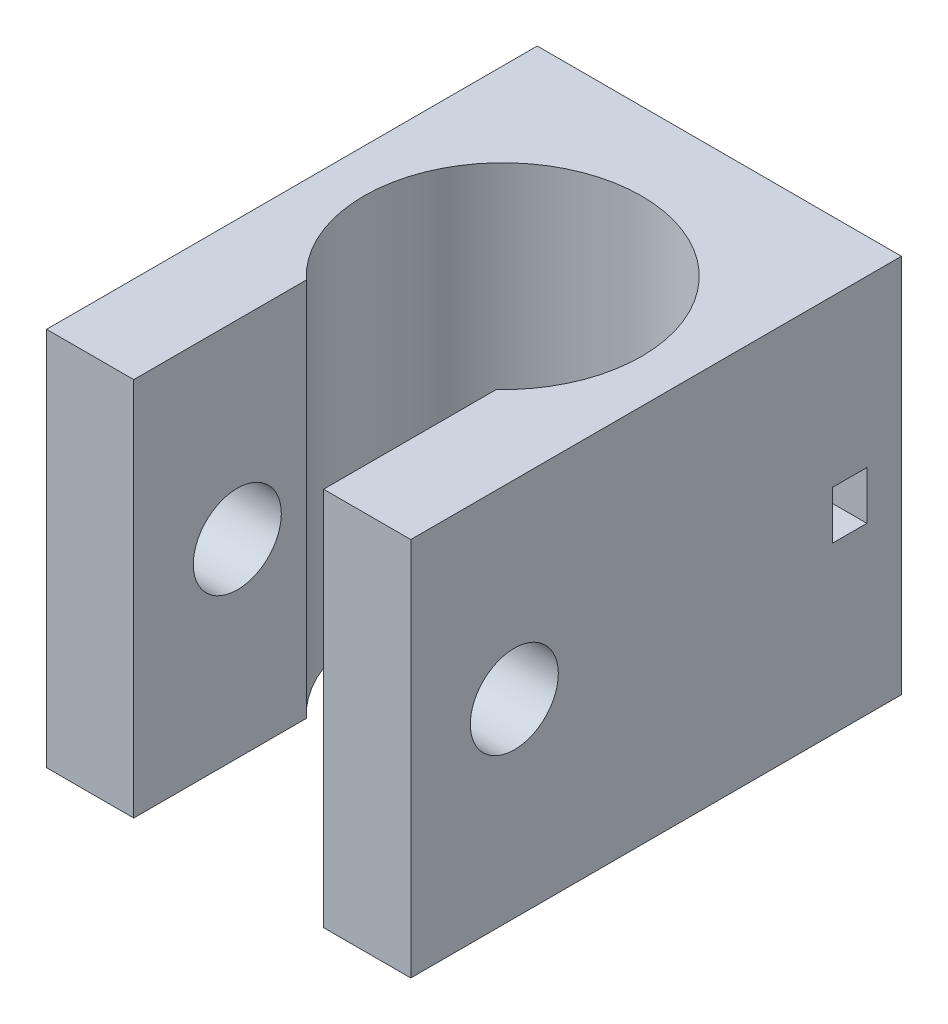
ISO-10303-21;
HEADER;
FILE_DESCRIPTION(('STEP AP214'),'2;1');
FILE_NAME('part.step','',(''),(''),'','','');
FILE_SCHEMA(('AUTOMOTIVE_DESIGN { 1 0 10303 214 1 1 1 1 }'));
ENDSEC;
DATA;
#1=APPLICATION_CONTEXT('core data for automotive mechanical design processes');
#2=APPLICATION_PROTOCOL_DEFINITION('international standard','automotive_design',2000,#1);
#3=PRODUCT_CONTEXT('',#1,'mechanical');
#4=PRODUCT('Part','Part','',(#3));
#5=PRODUCT_RELATED_PRODUCT_CATEGORY('part','',(#4));
#6=PRODUCT_DEFINITION_FORMATION('','',#4);
#7=PRODUCT_DEFINITION_CONTEXT('part definition',#1,'design');
#8=PRODUCT_DEFINITION('design','',#6,#7);
#9=PRODUCT_DEFINITION_SHAPE('','',#8);
#10=(LENGTH_UNIT() NAMED_UNIT(*) SI_UNIT(.MILLI.,.METRE.));
#11=(NAMED_UNIT(*) PLANE_ANGLE_UNIT() SI_UNIT($,.RADIAN.));
#12=(NAMED_UNIT(*) SI_UNIT($,.STERADIAN.) SOLID_ANGLE_UNIT());
#13=UNCERTAINTY_MEASURE_WITH_UNIT(LENGTH_MEASURE(1.E-05),#10,'distance_accuracy_value','');
#14=(GEOMETRIC_REPRESENTATION_CONTEXT(3) GLOBAL_UNCERTAINTY_ASSIGNED_CONTEXT((#13)) GLOBAL_UNIT_ASSIGNED_CONTEXT((#10,
#11,#12)) REPRESENTATION_CONTEXT('',''));
#15=CARTESIAN_POINT('',(0.,0.,0.));
#16=DIRECTION('',(0.,0.,1.));
#17=DIRECTION('',(1.,0.,0.));
#18=AXIS2_PLACEMENT_3D('',#15,#16,#17);
#19=CARTESIAN_POINT('',(-10.55,11.,-13.4281374601144));
#20=DIRECTION('',(0.,0.,1.));
#21=DIRECTION('',(1.,0.,0.));
#22=AXIS2_PLACEMENT_3D('',#19,#20,#21);
#23=PLANE('',#22);
#24=DIRECTION('',(0.,-1.,0.));
#25=VECTOR('',#24,1.);
#26=CARTESIAN_POINT('',(2.40000000000001,8.55,-13.4281374601144));
#27=LINE('',#26,#25);
#28=CARTESIAN_POINT('',(2.40000000000001,8.55,-13.4281374601144));
#29=VERTEX_POINT('',#28);
#30=CARTESIAN_POINT('',(2.40000000000001,3.65,-13.4281374601144));
#31=VERTEX_POINT('',#30);
#32=EDGE_CURVE('E193',#29,#31,#27,.T.);
#33=ORIENTED_EDGE('',*,*,#32,.F.);
#34=DIRECTION('',(1.,0.,0.));
#35=VECTOR('',#34,1.);
#36=CARTESIAN_POINT('',(2.40000000000001,8.55,-13.4281374601144));
#37=LINE('',#36,#35);
#38=CARTESIAN_POINT('',(-2.49999999999999,8.55,-13.4281374601144));
#39=VERTEX_POINT('',#38);
#40=EDGE_CURVE('E206',#39,#29,#37,.T.);
#41=ORIENTED_EDGE('',*,*,#40,.F.);
#42=DIRECTION('',(0.,1.,0.));
#43=VECTOR('',#42,1.);
#44=CARTESIAN_POINT('',(-2.49999999999999,8.55,-13.4281374601144));
#45=LINE('',#44,#43);
#46=CARTESIAN_POINT('',(-2.49999999999999,3.65,-13.4281374601144));
#47=VERTEX_POINT('',#46);
#48=EDGE_CURVE('E215',#47,#39,#45,.T.);
#49=ORIENTED_EDGE('',*,*,#48,.F.);
#50=DIRECTION('',(-1.,0.,0.));
#51=VECTOR('',#50,1.);
#52=CARTESIAN_POINT('',(2.40000000000001,3.65,-13.4281374601144));
#53=LINE('',#52,#51);
#54=EDGE_CURVE('E196',#31,#47,#53,.T.);
#55=ORIENTED_EDGE('',*,*,#54,.F.);
#56=EDGE_LOOP('',(#33,#41,#49,#55));
#57=FACE_BOUND('',#56,.T.);
#58=DIRECTION('',(-1.,0.,0.));
#59=VECTOR('',#58,1.);
#60=CARTESIAN_POINT('',(-10.55,-11.,-13.4281374601144));
#61=LINE('',#60,#59);
#62=CARTESIAN_POINT('',(10.55,-11.,-13.4281374601144));
#63=VERTEX_POINT('',#62);
#64=CARTESIAN_POINT('',(-10.55,-11.,-13.4281374601144));
#65=VERTEX_POINT('',#64);
#66=EDGE_CURVE('E302',#63,#65,#61,.T.);
#67=ORIENTED_EDGE('',*,*,#66,.T.);
#68=DIRECTION('',(0.,-1.,0.));
#69=VECTOR('',#68,1.);
#70=CARTESIAN_POINT('',(-10.55,11.,-13.4281374601144));
#71=LINE('',#70,#69);
#72=CARTESIAN_POINT('',(-10.55,11.,-13.4281374601144));
#73=VERTEX_POINT('',#72);
#74=EDGE_CURVE('E312',#73,#65,#71,.T.);
#75=ORIENTED_EDGE('',*,*,#74,.F.);
#76=DIRECTION('',(-1.,0.,0.));
#77=VECTOR('',#76,1.);
#78=CARTESIAN_POINT('',(-10.55,11.,-13.4281374601144));
#79=LINE('',#78,#77);
#80=CARTESIAN_POINT('',(10.55,11.,-13.4281374601144));
#81=VERTEX_POINT('',#80);
#82=EDGE_CURVE('E285',#81,#73,#79,.T.);
#83=ORIENTED_EDGE('',*,*,#82,.F.);
#84=DIRECTION('',(0.,-1.,0.));
#85=VECTOR('',#84,1.);
#86=CARTESIAN_POINT('',(10.55,11.,-13.4281374601144));
#87=LINE('',#86,#85);
#88=EDGE_CURVE('E315',#81,#63,#87,.T.);
#89=ORIENTED_EDGE('',*,*,#88,.T.);
#90=EDGE_LOOP('',(#67,#75,#83,#89));
#91=FACE_BOUND('',#90,.T.);
#92=DIRECTION('',(0.,1.,0.));
#93=VECTOR('',#92,1.);
#94=CARTESIAN_POINT('',(-2.49999999999999,-3.65,-13.4281374601144));
#95=LINE('',#94,#93);
#96=CARTESIAN_POINT('',(-2.49999999999999,-8.55,-13.4281374601144));
#97=VERTEX_POINT('',#96);
#98=CARTESIAN_POINT('',(-2.49999999999999,-3.65,-13.4281374601144));
#99=VERTEX_POINT('',#98);
#100=EDGE_CURVE('E192',#97,#99,#95,.T.);
#101=ORIENTED_EDGE('',*,*,#100,.F.);
#102=DIRECTION('',(-1.,0.,0.));
#103=VECTOR('',#102,1.);
#104=CARTESIAN_POINT('',(-2.49999999999999,-8.55,-13.4281374601144));
#105=LINE('',#104,#103);
#106=CARTESIAN_POINT('',(2.40000000000001,-8.55,-13.4281374601144));
#107=VERTEX_POINT('',#106);
#108=EDGE_CURVE('E189',#107,#97,#105,.T.);
#109=ORIENTED_EDGE('',*,*,#108,.F.);
#110=DIRECTION('',(0.,-1.,0.));
#111=VECTOR('',#110,1.);
#112=CARTESIAN_POINT('',(2.40000000000001,-3.65,-13.4281374601144));
#113=LINE('',#112,#111);
#114=CARTESIAN_POINT('',(2.40000000000001,-3.65,-13.4281374601144));
#115=VERTEX_POINT('',#114);
#116=EDGE_CURVE('E55',#115,#107,#113,.T.);
#117=ORIENTED_EDGE('',*,*,#116,.F.);
#118=DIRECTION('',(1.,0.,0.));
#119=VECTOR('',#118,1.);
#120=CARTESIAN_POINT('',(-2.49999999999999,-3.65,-13.4281374601144));
#121=LINE('',#120,#119);
#122=EDGE_CURVE('E50',#99,#115,#121,.T.);
#123=ORIENTED_EDGE('',*,*,#122,.F.);
#124=EDGE_LOOP('',(#101,#109,#117,#123));
#125=FACE_BOUND('',#124,.T.);
#126=ADVANCED_FACE('F35',(#57,#91,#125),#23,.F.);
#127=CARTESIAN_POINT('',(-5.49999999999999,11.,15.));
#128=DIRECTION('',(-1.,0.,0.));
#129=DIRECTION('',(0.,0.,1.));
#130=AXIS2_PLACEMENT_3D('',#127,#128,#129);
#131=PLANE('',#130);
#132=CARTESIAN_POINT('',(-5.49999999999999,0.,9.));
#133=DIRECTION('',(-1.,0.,0.));
#134=DIRECTION('',(0.,0.,1.));
#135=AXIS2_PLACEMENT_3D('',#132,#133,#134);
#136=CIRCLE('',#135,2.55);
#137=CARTESIAN_POINT('',(-5.49999999999999,0.,11.55));
#138=VERTEX_POINT('',#137);
#139=EDGE_CURVE('E269',#138,#138,#136,.T.);
#140=ORIENTED_EDGE('',*,*,#139,.T.);
#141=EDGE_LOOP('',(#140));
#142=FACE_BOUND('',#141,.T.);
#143=DIRECTION('',(0.,0.,-1.));
#144=VECTOR('',#143,1.);
#145=CARTESIAN_POINT('',(-5.49999999999999,-11.,15.));
#146=LINE('',#145,#144);
#147=CARTESIAN_POINT('',(-5.49999999999999,-11.,15.));
#148=VERTEX_POINT('',#147);
#149=CARTESIAN_POINT('',(-5.49999999999999,-11.,5.));
#150=VERTEX_POINT('',#149);
#151=EDGE_CURVE('E272',#148,#150,#146,.T.);
#152=ORIENTED_EDGE('',*,*,#151,.T.);
#153=DIRECTION('',(0.,-1.,0.));
#154=VECTOR('',#153,1.);
#155=CARTESIAN_POINT('',(-5.49999999999999,11.,5.));
#156=LINE('',#155,#154);
#157=CARTESIAN_POINT('',(-5.49999999999999,11.,5.));
#158=VERTEX_POINT('',#157);
#159=EDGE_CURVE('E11',#158,#150,#156,.T.);
#160=ORIENTED_EDGE('',*,*,#159,.F.);
#161=DIRECTION('',(0.,0.,-1.));
#162=VECTOR('',#161,1.);
#163=CARTESIAN_POINT('',(-5.49999999999999,11.,15.));
#164=LINE('',#163,#162);
#165=CARTESIAN_POINT('',(-5.49999999999999,11.,15.));
#166=VERTEX_POINT('',#165);
#167=EDGE_CURVE('E273',#166,#158,#164,.T.);
#168=ORIENTED_EDGE('',*,*,#167,.F.);
#169=DIRECTION('',(0.,-1.,0.));
#170=VECTOR('',#169,1.);
#171=CARTESIAN_POINT('',(-5.49999999999999,11.,15.));
#172=LINE('',#171,#170);
#173=EDGE_CURVE('E291',#166,#148,#172,.T.);
#174=ORIENTED_EDGE('',*,*,#173,.T.);
#175=EDGE_LOOP('',(#152,#160,#168,#174));
#176=FACE_BOUND('',#175,.T.);
#177=ADVANCED_FACE('F37',(#142,#176),#131,.F.);
#178=CARTESIAN_POINT('',(0.,11.,-0.878137460114387));
#179=DIRECTION('',(0.,-1.,0.));
#180=DIRECTION('',(0.,0.,-1.));
#181=AXIS2_PLACEMENT_3D('',#178,#179,#180);
#182=CYLINDRICAL_SURFACE('',#181,8.05);
#183=CARTESIAN_POINT('',(0.,-11.,-0.878137460114387));
#184=DIRECTION('',(0.,-1.,0.));
#185=DIRECTION('',(0.,0.,-1.));
#186=AXIS2_PLACEMENT_3D('',#183,#184,#185);
#187=CIRCLE('',#186,8.05);
#188=CARTESIAN_POINT('',(5.50000000000001,-11.,5.));
#189=VERTEX_POINT('',#188);
#190=EDGE_CURVE('E294',#150,#189,#187,.T.);
#191=ORIENTED_EDGE('',*,*,#190,.T.);
#192=DIRECTION('',(0.,-1.,0.));
#193=VECTOR('',#192,1.);
#194=CARTESIAN_POINT('',(5.50000000000001,11.,5.));
#195=LINE('',#194,#193);
#196=CARTESIAN_POINT('',(5.50000000000001,11.,5.));
#197=VERTEX_POINT('',#196);
#198=EDGE_CURVE('E43',#197,#189,#195,.T.);
#199=ORIENTED_EDGE('',*,*,#198,.F.);
#200=CARTESIAN_POINT('',(0.,11.,-0.878137460114387));
#201=DIRECTION('',(0.,-1.,0.));
#202=DIRECTION('',(0.,0.,-1.));
#203=AXIS2_PLACEMENT_3D('',#200,#201,#202);
#204=CIRCLE('',#203,8.05);
#205=EDGE_CURVE('E276',#158,#197,#204,.T.);
#206=ORIENTED_EDGE('',*,*,#205,.F.);
#207=ORIENTED_EDGE('',*,*,#159,.T.);
#208=EDGE_LOOP('',(#191,#199,#206,#207));
#209=FACE_BOUND('',#208,.T.);
#210=ADVANCED_FACE('F351',(#209),#182,.F.);
#211=CARTESIAN_POINT('',(5.50000000000001,11.,15.));
#212=DIRECTION('',(1.,0.,0.));
#213=DIRECTION('',(0.,0.,-1.));
#214=AXIS2_PLACEMENT_3D('',#211,#212,#213);
#215=PLANE('',#214);
#216=CARTESIAN_POINT('',(5.50000000000001,0.,8.99999999999999));
#217=DIRECTION('',(1.,0.,0.));
#218=DIRECTION('',(0.,0.,-1.));
#219=AXIS2_PLACEMENT_3D('',#216,#217,#218);
#220=CIRCLE('',#219,2.55);
#221=CARTESIAN_POINT('',(5.50000000000001,0.,6.44999999999999));
#222=VERTEX_POINT('',#221);
#223=EDGE_CURVE('E266',#222,#222,#220,.T.);
#224=ORIENTED_EDGE('',*,*,#223,.T.);
#225=EDGE_LOOP('',(#224));
#226=FACE_BOUND('',#225,.T.);
#227=DIRECTION('',(0.,0.,1.));
#228=VECTOR('',#227,1.);
#229=CARTESIAN_POINT('',(5.50000000000001,-11.,15.));
#230=LINE('',#229,#228);
#231=CARTESIAN_POINT('',(5.50000000000001,-11.,15.));
#232=VERTEX_POINT('',#231);
#233=EDGE_CURVE('E296',#189,#232,#230,.T.);
#234=ORIENTED_EDGE('',*,*,#233,.T.);
#235=DIRECTION('',(0.,-1.,0.));
#236=VECTOR('',#235,1.);
#237=CARTESIAN_POINT('',(5.50000000000001,11.,15.));
#238=LINE('',#237,#236);
#239=CARTESIAN_POINT('',(5.50000000000001,11.,15.));
#240=VERTEX_POINT('',#239);
#241=EDGE_CURVE('E321',#240,#232,#238,.T.);
#242=ORIENTED_EDGE('',*,*,#241,.F.);
#243=DIRECTION('',(0.,0.,1.));
#244=VECTOR('',#243,1.);
#245=CARTESIAN_POINT('',(5.50000000000001,11.,15.));
#246=LINE('',#245,#244);
#247=EDGE_CURVE('E279',#197,#240,#246,.T.);
#248=ORIENTED_EDGE('',*,*,#247,.F.);
#249=ORIENTED_EDGE('',*,*,#198,.T.);
#250=EDGE_LOOP('',(#234,#242,#248,#249));
#251=FACE_BOUND('',#250,.T.);
#252=ADVANCED_FACE('F328',(#226,#251),#215,.F.);
#253=CARTESIAN_POINT('',(10.55,11.,15.));
#254=DIRECTION('',(0.,0.,-1.));
#255=DIRECTION('',(-1.,0.,0.));
#256=AXIS2_PLACEMENT_3D('',#253,#254,#255);
#257=PLANE('',#256);
#258=DIRECTION('',(1.,0.,0.));
#259=VECTOR('',#258,1.);
#260=CARTESIAN_POINT('',(10.55,-11.,15.));
#261=LINE('',#260,#259);
#262=CARTESIAN_POINT('',(10.55,-11.,15.));
#263=VERTEX_POINT('',#262);
#264=EDGE_CURVE('E298',#232,#263,#261,.T.);
#265=ORIENTED_EDGE('',*,*,#264,.T.);
#266=DIRECTION('',(0.,-1.,0.));
#267=VECTOR('',#266,1.);
#268=CARTESIAN_POINT('',(10.55,11.,15.));
#269=LINE('',#268,#267);
#270=CARTESIAN_POINT('',(10.55,11.,15.));
#271=VERTEX_POINT('',#270);
#272=EDGE_CURVE('E318',#271,#263,#269,.T.);
#273=ORIENTED_EDGE('',*,*,#272,.F.);
#274=DIRECTION('',(1.,0.,0.));
#275=VECTOR('',#274,1.);
#276=CARTESIAN_POINT('',(10.55,11.,15.));
#277=LINE('',#276,#275);
#278=EDGE_CURVE('E281',#240,#271,#277,.T.);
#279=ORIENTED_EDGE('',*,*,#278,.F.);
#280=ORIENTED_EDGE('',*,*,#241,.T.);
#281=EDGE_LOOP('',(#265,#273,#279,#280));
#282=FACE_BOUND('',#281,.T.);
#283=ADVANCED_FACE('F339',(#282),#257,.F.);
#284=CARTESIAN_POINT('',(10.55,11.,-13.4281374601144));
#285=DIRECTION('',(-1.,0.,0.));
#286=DIRECTION('',(0.,0.,1.));
#287=AXIS2_PLACEMENT_3D('',#284,#285,#286);
#288=PLANE('',#287);
#289=DIRECTION('',(0.,0.,-1.));
#290=VECTOR('',#289,1.);
#291=CARTESIAN_POINT('',(10.55,-1.4,-9.42813746011439));
#292=LINE('',#291,#290);
#293=CARTESIAN_POINT('',(10.55,-1.4,-9.42813746011438));
#294=VERTEX_POINT('',#293);
#295=CARTESIAN_POINT('',(10.55,-1.4,-11.4281374601144));
#296=VERTEX_POINT('',#295);
#297=EDGE_CURVE('E242',#294,#296,#292,.T.);
#298=ORIENTED_EDGE('',*,*,#297,.F.);
#299=DIRECTION('',(0.,-1.,0.));
#300=VECTOR('',#299,1.);
#301=CARTESIAN_POINT('',(10.55,1.4,-9.42813746011439));
#302=LINE('',#301,#300);
#303=CARTESIAN_POINT('',(10.55,1.4,-9.42813746011439));
#304=VERTEX_POINT('',#303);
#305=EDGE_CURVE('E231',#304,#294,#302,.T.);
#306=ORIENTED_EDGE('',*,*,#305,.F.);
#307=DIRECTION('',(0.,0.,1.));
#308=VECTOR('',#307,1.);
#309=CARTESIAN_POINT('',(10.55,1.4,-9.42813746011439));
#310=LINE('',#309,#308);
#311=CARTESIAN_POINT('',(10.55,1.4,-11.4281374601144));
#312=VERTEX_POINT('',#311);
#313=EDGE_CURVE('E248',#312,#304,#310,.T.);
#314=ORIENTED_EDGE('',*,*,#313,.F.);
#315=DIRECTION('',(0.,1.,0.));
#316=VECTOR('',#315,1.);
#317=CARTESIAN_POINT('',(10.55,1.4,-11.4281374601144));
#318=LINE('',#317,#316);
#319=EDGE_CURVE('E245',#296,#312,#318,.T.);
#320=ORIENTED_EDGE('',*,*,#319,.F.);
#321=EDGE_LOOP('',(#298,#306,#314,#320));
#322=FACE_BOUND('',#321,.T.);
#323=CARTESIAN_POINT('',(10.55,0.,8.99999999999999));
#324=DIRECTION('',(1.,0.,0.));
#325=DIRECTION('',(0.,0.,-1.));
#326=AXIS2_PLACEMENT_3D('',#323,#324,#325);
#327=CIRCLE('',#326,2.55);
#328=CARTESIAN_POINT('',(10.55,0.,6.44999999999999));
#329=VERTEX_POINT('',#328);
#330=EDGE_CURVE('E260',#329,#329,#327,.T.);
#331=ORIENTED_EDGE('',*,*,#330,.F.);
#332=EDGE_LOOP('',(#331));
#333=FACE_BOUND('',#332,.T.);
#334=DIRECTION('',(0.,0.,-1.));
#335=VECTOR('',#334,1.);
#336=CARTESIAN_POINT('',(10.55,-11.,-13.4281374601144));
#337=LINE('',#336,#335);
#338=EDGE_CURVE('E300',#263,#63,#337,.T.);
#339=ORIENTED_EDGE('',*,*,#338,.T.);
#340=ORIENTED_EDGE('',*,*,#88,.F.);
#341=DIRECTION('',(0.,0.,-1.));
#342=VECTOR('',#341,1.);
#343=CARTESIAN_POINT('',(10.55,11.,-13.4281374601144));
#344=LINE('',#343,#342);
#345=EDGE_CURVE('E283',#271,#81,#344,.T.);
#346=ORIENTED_EDGE('',*,*,#345,.F.);
#347=ORIENTED_EDGE('',*,*,#272,.T.);
#348=EDGE_LOOP('',(#339,#340,#346,#347));
#349=FACE_BOUND('',#348,.T.);
#350=ADVANCED_FACE('F343',(#322,#333,#349),#288,.F.);
#351=CARTESIAN_POINT('',(-10.55,11.,15.));
#352=DIRECTION('',(1.,0.,0.));
#353=DIRECTION('',(0.,0.,-1.));
#354=AXIS2_PLACEMENT_3D('',#351,#352,#353);
#355=PLANE('',#354);
#356=DIRECTION('',(0.,0.,-1.));
#357=VECTOR('',#356,1.);
#358=CARTESIAN_POINT('',(-10.55,1.4,-9.42813746011438));
#359=LINE('',#358,#357);
#360=CARTESIAN_POINT('',(-10.55,1.4,-9.42813746011438));
#361=VERTEX_POINT('',#360);
#362=CARTESIAN_POINT('',(-10.55,1.4,-11.4281374601144));
#363=VERTEX_POINT('',#362);
#364=EDGE_CURVE('E235',#361,#363,#359,.T.);
#365=ORIENTED_EDGE('',*,*,#364,.F.);
#366=DIRECTION('',(0.,1.,0.));
#367=VECTOR('',#366,1.);
#368=CARTESIAN_POINT('',(-10.55,1.4,-9.42813746011438));
#369=LINE('',#368,#367);
#370=CARTESIAN_POINT('',(-10.55,-1.4,-9.42813746011438));
#371=VERTEX_POINT('',#370);
#372=EDGE_CURVE('E238',#371,#361,#369,.T.);
#373=ORIENTED_EDGE('',*,*,#372,.F.);
#374=DIRECTION('',(0.,0.,1.));
#375=VECTOR('',#374,1.);
#376=CARTESIAN_POINT('',(-10.55,-1.4,-9.42813746011438));
#377=LINE('',#376,#375);
#378=CARTESIAN_POINT('',(-10.55,-1.4,-11.4281374601144));
#379=VERTEX_POINT('',#378);
#380=EDGE_CURVE('E240',#379,#371,#377,.T.);
#381=ORIENTED_EDGE('',*,*,#380,.F.);
#382=DIRECTION('',(0.,-1.,0.));
#383=VECTOR('',#382,1.);
#384=CARTESIAN_POINT('',(-10.55,1.4,-11.4281374601144));
#385=LINE('',#384,#383);
#386=EDGE_CURVE('E232',#363,#379,#385,.T.);
#387=ORIENTED_EDGE('',*,*,#386,.F.);
#388=EDGE_LOOP('',(#365,#373,#381,#387));
#389=FACE_BOUND('',#388,.T.);
#390=CARTESIAN_POINT('',(-10.55,0.,9.));
#391=DIRECTION('',(1.,0.,0.));
#392=DIRECTION('',(0.,0.,-1.));
#393=AXIS2_PLACEMENT_3D('',#390,#391,#392);
#394=CIRCLE('',#393,2.55);
#395=CARTESIAN_POINT('',(-10.55,0.,6.44999999999999));
#396=VERTEX_POINT('',#395);
#397=EDGE_CURVE('E263',#396,#396,#394,.F.);
#398=ORIENTED_EDGE('',*,*,#397,.F.);
#399=EDGE_LOOP('',(#398));
#400=FACE_BOUND('',#399,.T.);
#401=DIRECTION('',(0.,0.,1.));
#402=VECTOR('',#401,1.);
#403=CARTESIAN_POINT('',(-10.55,-11.,15.));
#404=LINE('',#403,#402);
#405=CARTESIAN_POINT('',(-10.55,-11.,15.));
#406=VERTEX_POINT('',#405);
#407=EDGE_CURVE('E304',#65,#406,#404,.T.);
#408=ORIENTED_EDGE('',*,*,#407,.T.);
#409=DIRECTION('',(0.,-1.,0.));
#410=VECTOR('',#409,1.);
#411=CARTESIAN_POINT('',(-10.55,11.,15.));
#412=LINE('',#411,#410);
#413=CARTESIAN_POINT('',(-10.55,11.,15.));
#414=VERTEX_POINT('',#413);
#415=EDGE_CURVE('E309',#414,#406,#412,.T.);
#416=ORIENTED_EDGE('',*,*,#415,.F.);
#417=DIRECTION('',(0.,0.,1.));
#418=VECTOR('',#417,1.);
#419=CARTESIAN_POINT('',(-10.55,11.,15.));
#420=LINE('',#419,#418);
#421=EDGE_CURVE('E287',#73,#414,#420,.T.);
#422=ORIENTED_EDGE('',*,*,#421,.F.);
#423=ORIENTED_EDGE('',*,*,#74,.T.);
#424=EDGE_LOOP('',(#408,#416,#422,#423));
#425=FACE_BOUND('',#424,.T.);
#426=ADVANCED_FACE('F362',(#389,#400,#425),#355,.F.);
#427=CARTESIAN_POINT('',(-5.49999999999999,11.,15.));
#428=DIRECTION('',(0.,0.,-1.));
#429=DIRECTION('',(-1.,0.,0.));
#430=AXIS2_PLACEMENT_3D('',#427,#428,#429);
#431=PLANE('',#430);
#432=DIRECTION('',(1.,0.,0.));
#433=VECTOR('',#432,1.);
#434=CARTESIAN_POINT('',(-5.49999999999999,-11.,15.));
#435=LINE('',#434,#433);
#436=EDGE_CURVE('E277',#406,#148,#435,.T.);
#437=ORIENTED_EDGE('',*,*,#436,.T.);
#438=ORIENTED_EDGE('',*,*,#173,.F.);
#439=DIRECTION('',(1.,0.,0.));
#440=VECTOR('',#439,1.);
#441=CARTESIAN_POINT('',(-5.49999999999999,11.,15.));
#442=LINE('',#441,#440);
#443=EDGE_CURVE('E289',#414,#166,#442,.T.);
#444=ORIENTED_EDGE('',*,*,#443,.F.);
#445=ORIENTED_EDGE('',*,*,#415,.T.);
#446=EDGE_LOOP('',(#437,#438,#444,#445));
#447=FACE_BOUND('',#446,.T.);
#448=ADVANCED_FACE('F357',(#447),#431,.F.);
#449=CARTESIAN_POINT('',(0.,11.,-0.878137460114387));
#450=DIRECTION('',(0.,-1.,0.));
#451=DIRECTION('',(0.,0.,-1.));
#452=AXIS2_PLACEMENT_3D('',#449,#450,#451);
#453=PLANE('',#452);
#454=ORIENTED_EDGE('',*,*,#167,.T.);
#455=ORIENTED_EDGE('',*,*,#205,.T.);
#456=ORIENTED_EDGE('',*,*,#247,.T.);
#457=ORIENTED_EDGE('',*,*,#278,.T.);
#458=ORIENTED_EDGE('',*,*,#345,.T.);
#459=ORIENTED_EDGE('',*,*,#82,.T.);
#460=ORIENTED_EDGE('',*,*,#421,.T.);
#461=ORIENTED_EDGE('',*,*,#443,.T.);
#462=EDGE_LOOP('',(#454,#455,#456,#457,#458,#459,#460,#461));
#463=FACE_BOUND('',#462,.T.);
#464=ADVANCED_FACE('F347',(#463),#453,.F.);
#465=CARTESIAN_POINT('',(0.,-11.,-0.878137460114387));
#466=DIRECTION('',(0.,-1.,0.));
#467=DIRECTION('',(0.,0.,-1.));
#468=AXIS2_PLACEMENT_3D('',#465,#466,#467);
#469=PLANE('',#468);
#470=ORIENTED_EDGE('',*,*,#151,.F.);
#471=ORIENTED_EDGE('',*,*,#436,.F.);
#472=ORIENTED_EDGE('',*,*,#407,.F.);
#473=ORIENTED_EDGE('',*,*,#66,.F.);
#474=ORIENTED_EDGE('',*,*,#338,.F.);
#475=ORIENTED_EDGE('',*,*,#264,.F.);
#476=ORIENTED_EDGE('',*,*,#233,.F.);
#477=ORIENTED_EDGE('',*,*,#190,.F.);
#478=EDGE_LOOP('',(#470,#471,#472,#473,#474,#475,#476,#477));
#479=FACE_BOUND('',#478,.T.);
#480=ADVANCED_FACE('F334',(#479),#469,.T.);
#481=CARTESIAN_POINT('',(-17.7624891681028,0.,9.));
#482=DIRECTION('',(1.,0.,0.));
#483=DIRECTION('',(0.,0.,-1.));
#484=AXIS2_PLACEMENT_3D('',#481,#482,#483);
#485=CYLINDRICAL_SURFACE('',#484,2.55);
#486=ORIENTED_EDGE('',*,*,#397,.T.);
#487=EDGE_LOOP('',(#486));
#488=FACE_BOUND('',#487,.T.);
#489=ORIENTED_EDGE('',*,*,#139,.F.);
#490=EDGE_LOOP('',(#489));
#491=FACE_BOUND('',#490,.T.);
#492=ADVANCED_FACE('F431',(#488,#491),#485,.F.);
#493=ORIENTED_EDGE('',*,*,#330,.T.);
#494=EDGE_LOOP('',(#493));
#495=FACE_BOUND('',#494,.T.);
#496=ORIENTED_EDGE('',*,*,#223,.F.);
#497=EDGE_LOOP('',(#496));
#498=FACE_BOUND('',#497,.T.);
#499=ADVANCED_FACE('F429',(#495,#498),#485,.F.);
#500=CARTESIAN_POINT('',(-13.990930106817,1.4,-9.42813746011438));
#501=DIRECTION('',(0.,0.,1.));
#502=DIRECTION('',(1.,0.,0.));
#503=AXIS2_PLACEMENT_3D('',#500,#501,#502);
#504=PLANE('',#503);
#505=ORIENTED_EDGE('',*,*,#372,.T.);
#506=DIRECTION('',(1.,0.,0.));
#507=VECTOR('',#506,1.);
#508=CARTESIAN_POINT('',(-13.990930106817,1.4,-9.42813746011438));
#509=LINE('',#508,#507);
#510=EDGE_CURVE('E236',#361,#304,#509,.T.);
#511=ORIENTED_EDGE('',*,*,#510,.T.);
#512=ORIENTED_EDGE('',*,*,#305,.T.);
#513=DIRECTION('',(1.,0.,0.));
#514=VECTOR('',#513,1.);
#515=CARTESIAN_POINT('',(-13.990930106817,-1.4,-9.42813746011438));
#516=LINE('',#515,#514);
#517=EDGE_CURVE('E251',#371,#294,#516,.T.);
#518=ORIENTED_EDGE('',*,*,#517,.F.);
#519=EDGE_LOOP('',(#505,#511,#512,#518));
#520=FACE_BOUND('',#519,.T.);
#521=ADVANCED_FACE('F419',(#520),#504,.F.);
#522=CARTESIAN_POINT('',(-13.990930106817,1.4,-9.42813746011438));
#523=DIRECTION('',(0.,1.,0.));
#524=DIRECTION('',(0.,0.,1.));
#525=AXIS2_PLACEMENT_3D('',#522,#523,#524);
#526=PLANE('',#525);
#527=ORIENTED_EDGE('',*,*,#364,.T.);
#528=DIRECTION('',(1.,0.,0.));
#529=VECTOR('',#528,1.);
#530=CARTESIAN_POINT('',(-13.990930106817,1.4,-11.4281374601144));
#531=LINE('',#530,#529);
#532=EDGE_CURVE('E253',#363,#312,#531,.T.);
#533=ORIENTED_EDGE('',*,*,#532,.T.);
#534=ORIENTED_EDGE('',*,*,#313,.T.);
#535=ORIENTED_EDGE('',*,*,#510,.F.);
#536=EDGE_LOOP('',(#527,#533,#534,#535));
#537=FACE_BOUND('',#536,.T.);
#538=ADVANCED_FACE('F415',(#537),#526,.F.);
#539=CARTESIAN_POINT('',(-13.990930106817,1.4,-11.4281374601144));
#540=DIRECTION('',(0.,0.,-1.));
#541=DIRECTION('',(0.,1.,0.));
#542=AXIS2_PLACEMENT_3D('',#539,#540,#541);
#543=PLANE('',#542);
#544=ORIENTED_EDGE('',*,*,#386,.T.);
#545=DIRECTION('',(1.,0.,0.));
#546=VECTOR('',#545,1.);
#547=CARTESIAN_POINT('',(-13.990930106817,-1.4,-11.4281374601144));
#548=LINE('',#547,#546);
#549=EDGE_CURVE('E255',#379,#296,#548,.T.);
#550=ORIENTED_EDGE('',*,*,#549,.T.);
#551=ORIENTED_EDGE('',*,*,#319,.T.);
#552=ORIENTED_EDGE('',*,*,#532,.F.);
#553=EDGE_LOOP('',(#544,#550,#551,#552));
#554=FACE_BOUND('',#553,.T.);
#555=ADVANCED_FACE('F418',(#554),#543,.F.);
#556=CARTESIAN_POINT('',(-13.990930106817,-1.4,-9.42813746011438));
#557=DIRECTION('',(0.,-1.,0.));
#558=DIRECTION('',(0.,0.,-1.));
#559=AXIS2_PLACEMENT_3D('',#556,#557,#558);
#560=PLANE('',#559);
#561=ORIENTED_EDGE('',*,*,#380,.T.);
#562=ORIENTED_EDGE('',*,*,#517,.T.);
#563=ORIENTED_EDGE('',*,*,#297,.T.);
#564=ORIENTED_EDGE('',*,*,#549,.F.);
#565=EDGE_LOOP('',(#561,#562,#563,#564));
#566=FACE_BOUND('',#565,.T.);
#567=ADVANCED_FACE('F413',(#566),#560,.F.);
#568=CARTESIAN_POINT('',(2.40000000000001,8.55,-15.4281374601144));
#569=DIRECTION('',(-1.,0.,0.));
#570=DIRECTION('',(0.,-1.,0.));
#571=AXIS2_PLACEMENT_3D('',#568,#569,#570);
#572=PLANE('',#571);
#573=ORIENTED_EDGE('',*,*,#32,.T.);
#574=DIRECTION('',(0.,0.,1.));
#575=VECTOR('',#574,1.);
#576=CARTESIAN_POINT('',(2.40000000000001,3.65,-15.4281374601144));
#577=LINE('',#576,#575);
#578=CARTESIAN_POINT('',(2.40000000000001,3.65,-15.4281374601144));
#579=VERTEX_POINT('',#578);
#580=EDGE_CURVE('E228',#579,#31,#577,.T.);
#581=ORIENTED_EDGE('',*,*,#580,.F.);
#582=DIRECTION('',(0.,-1.,0.));
#583=VECTOR('',#582,1.);
#584=CARTESIAN_POINT('',(2.40000000000001,8.55,-15.4281374601144));
#585=LINE('',#584,#583);
#586=CARTESIAN_POINT('',(2.40000000000001,8.55,-15.4281374601144));
#587=VERTEX_POINT('',#586);
#588=EDGE_CURVE('E202',#587,#579,#585,.T.);
#589=ORIENTED_EDGE('',*,*,#588,.F.);
#590=DIRECTION('',(0.,0.,1.));
#591=VECTOR('',#590,1.);
#592=CARTESIAN_POINT('',(2.40000000000001,8.55,-15.4281374601144));
#593=LINE('',#592,#591);
#594=EDGE_CURVE('E211',#587,#29,#593,.T.);
#595=ORIENTED_EDGE('',*,*,#594,.T.);
#596=EDGE_LOOP('',(#573,#581,#589,#595));
#597=FACE_BOUND('',#596,.T.);
#598=ADVANCED_FACE('F409',(#597),#572,.F.);
#599=CARTESIAN_POINT('',(2.40000000000001,3.65,-15.4281374601144));
#600=DIRECTION('',(0.,1.,0.));
#601=DIRECTION('',(0.,0.,1.));
#602=AXIS2_PLACEMENT_3D('',#599,#600,#601);
#603=PLANE('',#602);
#604=ORIENTED_EDGE('',*,*,#54,.T.);
#605=DIRECTION('',(0.,0.,1.));
#606=VECTOR('',#605,1.);
#607=CARTESIAN_POINT('',(-2.49999999999999,3.65,-15.4281374601144));
#608=LINE('',#607,#606);
#609=CARTESIAN_POINT('',(-2.49999999999999,3.65,-15.4281374601144));
#610=VERTEX_POINT('',#609);
#611=EDGE_CURVE('E225',#610,#47,#608,.T.);
#612=ORIENTED_EDGE('',*,*,#611,.F.);
#613=DIRECTION('',(-1.,0.,0.));
#614=VECTOR('',#613,1.);
#615=CARTESIAN_POINT('',(2.40000000000001,3.65,-15.4281374601144));
#616=LINE('',#615,#614);
#617=EDGE_CURVE('E205',#579,#610,#616,.T.);
#618=ORIENTED_EDGE('',*,*,#617,.F.);
#619=ORIENTED_EDGE('',*,*,#580,.T.);
#620=EDGE_LOOP('',(#604,#612,#618,#619));
#621=FACE_BOUND('',#620,.T.);
#622=ADVANCED_FACE('F405',(#621),#603,.F.);
#623=CARTESIAN_POINT('',(-2.49999999999999,8.55,-15.4281374601144));
#624=DIRECTION('',(1.,0.,0.));
#625=DIRECTION('',(0.,1.,0.));
#626=AXIS2_PLACEMENT_3D('',#623,#624,#625);
#627=PLANE('',#626);
#628=ORIENTED_EDGE('',*,*,#48,.T.);
#629=DIRECTION('',(0.,0.,1.));
#630=VECTOR('',#629,1.);
#631=CARTESIAN_POINT('',(-2.49999999999999,8.55,-15.4281374601144));
#632=LINE('',#631,#630);
#633=CARTESIAN_POINT('',(-2.49999999999999,8.55,-15.4281374601144));
#634=VERTEX_POINT('',#633);
#635=EDGE_CURVE('E222',#634,#39,#632,.T.);
#636=ORIENTED_EDGE('',*,*,#635,.F.);
#637=DIRECTION('',(0.,1.,0.));
#638=VECTOR('',#637,1.);
#639=CARTESIAN_POINT('',(-2.49999999999999,8.55,-15.4281374601144));
#640=LINE('',#639,#638);
#641=EDGE_CURVE('E208',#610,#634,#640,.T.);
#642=ORIENTED_EDGE('',*,*,#641,.F.);
#643=ORIENTED_EDGE('',*,*,#611,.T.);
#644=EDGE_LOOP('',(#628,#636,#642,#643));
#645=FACE_BOUND('',#644,.T.);
#646=ADVANCED_FACE('F401',(#645),#627,.F.);
#647=CARTESIAN_POINT('',(2.40000000000001,8.55,-15.4281374601144));
#648=DIRECTION('',(0.,-1.,0.));
#649=DIRECTION('',(0.,0.,-1.));
#650=AXIS2_PLACEMENT_3D('',#647,#648,#649);
#651=PLANE('',#650);
#652=ORIENTED_EDGE('',*,*,#40,.T.);
#653=ORIENTED_EDGE('',*,*,#594,.F.);
#654=DIRECTION('',(1.,0.,0.));
#655=VECTOR('',#654,1.);
#656=CARTESIAN_POINT('',(2.40000000000001,8.55,-15.4281374601144));
#657=LINE('',#656,#655);
#658=EDGE_CURVE('E210',#634,#587,#657,.T.);
#659=ORIENTED_EDGE('',*,*,#658,.F.);
#660=ORIENTED_EDGE('',*,*,#635,.T.);
#661=EDGE_LOOP('',(#652,#653,#659,#660));
#662=FACE_BOUND('',#661,.T.);
#663=ADVANCED_FACE('F397',(#662),#651,.F.);
#664=CARTESIAN_POINT('',(0.,0.,-15.4281374601144));
#665=DIRECTION('',(0.,0.,-1.));
#666=DIRECTION('',(-1.,0.,0.));
#667=AXIS2_PLACEMENT_3D('',#664,#665,#666);
#668=PLANE('',#667);
#669=ORIENTED_EDGE('',*,*,#588,.T.);
#670=ORIENTED_EDGE('',*,*,#617,.T.);
#671=ORIENTED_EDGE('',*,*,#641,.T.);
#672=ORIENTED_EDGE('',*,*,#658,.T.);
#673=EDGE_LOOP('',(#669,#670,#671,#672));
#674=FACE_BOUND('',#673,.T.);
#675=ADVANCED_FACE('F394',(#674),#668,.T.);
#676=CARTESIAN_POINT('',(-2.49999999999999,-3.65,-15.4281374601144));
#677=DIRECTION('',(1.,0.,0.));
#678=DIRECTION('',(0.,1.,0.));
#679=AXIS2_PLACEMENT_3D('',#676,#677,#678);
#680=PLANE('',#679);
#681=ORIENTED_EDGE('',*,*,#100,.T.);
#682=DIRECTION('',(0.,0.,1.));
#683=VECTOR('',#682,1.);
#684=CARTESIAN_POINT('',(-2.49999999999999,-3.65,-15.4281374601144));
#685=LINE('',#684,#683);
#686=CARTESIAN_POINT('',(-2.49999999999999,-3.65,-15.4281374601144));
#687=VERTEX_POINT('',#686);
#688=EDGE_CURVE('E173',#687,#99,#685,.T.);
#689=ORIENTED_EDGE('',*,*,#688,.F.);
#690=DIRECTION('',(0.,1.,0.));
#691=VECTOR('',#690,1.);
#692=CARTESIAN_POINT('',(-2.49999999999999,-3.65,-15.4281374601144));
#693=LINE('',#692,#691);
#694=CARTESIAN_POINT('',(-2.49999999999999,-8.55,-15.4281374601144));
#695=VERTEX_POINT('',#694);
#696=EDGE_CURVE('E180',#695,#687,#693,.T.);
#697=ORIENTED_EDGE('',*,*,#696,.F.);
#698=DIRECTION('',(0.,0.,1.));
#699=VECTOR('',#698,1.);
#700=CARTESIAN_POINT('',(-2.49999999999999,-8.55,-15.4281374601144));
#701=LINE('',#700,#699);
#702=EDGE_CURVE('E372',#695,#97,#701,.T.);
#703=ORIENTED_EDGE('',*,*,#702,.T.);
#704=EDGE_LOOP('',(#681,#689,#697,#703));
#705=FACE_BOUND('',#704,.T.);
#706=ADVANCED_FACE('F191',(#705),#680,.F.);
#707=CARTESIAN_POINT('',(-2.49999999999999,-3.65,-15.4281374601144));
#708=DIRECTION('',(0.,-1.,0.));
#709=DIRECTION('',(1.,0.,0.));
#710=AXIS2_PLACEMENT_3D('',#707,#708,#709);
#711=PLANE('',#710);
#712=ORIENTED_EDGE('',*,*,#122,.T.);
#713=DIRECTION('',(0.,0.,1.));
#714=VECTOR('',#713,1.);
#715=CARTESIAN_POINT('',(2.40000000000001,-3.65,-15.4281374601144));
#716=LINE('',#715,#714);
#717=CARTESIAN_POINT('',(2.40000000000001,-3.65,-15.4281374601144));
#718=VERTEX_POINT('',#717);
#719=EDGE_CURVE('E176',#718,#115,#716,.T.);
#720=ORIENTED_EDGE('',*,*,#719,.F.);
#721=DIRECTION('',(1.,0.,0.));
#722=VECTOR('',#721,1.);
#723=CARTESIAN_POINT('',(-2.49999999999999,-3.65,-15.4281374601144));
#724=LINE('',#723,#722);
#725=EDGE_CURVE('E169',#687,#718,#724,.T.);
#726=ORIENTED_EDGE('',*,*,#725,.F.);
#727=ORIENTED_EDGE('',*,*,#688,.T.);
#728=EDGE_LOOP('',(#712,#720,#726,#727));
#729=FACE_BOUND('',#728,.T.);
#730=ADVANCED_FACE('F171',(#729),#711,.F.);
#731=CARTESIAN_POINT('',(2.40000000000001,-3.65,-15.4281374601144));
#732=DIRECTION('',(-1.,0.,0.));
#733=DIRECTION('',(0.,-1.,0.));
#734=AXIS2_PLACEMENT_3D('',#731,#732,#733);
#735=PLANE('',#734);
#736=ORIENTED_EDGE('',*,*,#116,.T.);
#737=DIRECTION('',(0.,0.,1.));
#738=VECTOR('',#737,1.);
#739=CARTESIAN_POINT('',(2.40000000000001,-8.55,-15.4281374601144));
#740=LINE('',#739,#738);
#741=CARTESIAN_POINT('',(2.40000000000001,-8.55,-15.4281374601144));
#742=VERTEX_POINT('',#741);
#743=EDGE_CURVE('E198',#742,#107,#740,.T.);
#744=ORIENTED_EDGE('',*,*,#743,.F.);
#745=DIRECTION('',(0.,-1.,0.));
#746=VECTOR('',#745,1.);
#747=CARTESIAN_POINT('',(2.40000000000001,-3.65,-15.4281374601144));
#748=LINE('',#747,#746);
#749=EDGE_CURVE('E179',#718,#742,#748,.T.);
#750=ORIENTED_EDGE('',*,*,#749,.F.);
#751=ORIENTED_EDGE('',*,*,#719,.T.);
#752=EDGE_LOOP('',(#736,#744,#750,#751));
#753=FACE_BOUND('',#752,.T.);
#754=ADVANCED_FACE('F381',(#753),#735,.F.);
#755=CARTESIAN_POINT('',(-2.49999999999999,-8.55,-15.4281374601144));
#756=DIRECTION('',(0.,1.,0.));
#757=DIRECTION('',(0.,0.,1.));
#758=AXIS2_PLACEMENT_3D('',#755,#756,#757);
#759=PLANE('',#758);
#760=ORIENTED_EDGE('',*,*,#108,.T.);
#761=ORIENTED_EDGE('',*,*,#702,.F.);
#762=DIRECTION('',(-1.,0.,0.));
#763=VECTOR('',#762,1.);
#764=CARTESIAN_POINT('',(-2.49999999999999,-8.55,-15.4281374601144));
#765=LINE('',#764,#763);
#766=EDGE_CURVE('E185',#742,#695,#765,.T.);
#767=ORIENTED_EDGE('',*,*,#766,.F.);
#768=ORIENTED_EDGE('',*,*,#743,.T.);
#769=EDGE_LOOP('',(#760,#761,#767,#768));
#770=FACE_BOUND('',#769,.T.);
#771=ADVANCED_FACE('F371',(#770),#759,.F.);
#772=CARTESIAN_POINT('',(0.,0.,-15.4281374601144));
#773=DIRECTION('',(0.,0.,1.));
#774=DIRECTION('',(1.,0.,0.));
#775=AXIS2_PLACEMENT_3D('',#772,#773,#774);
#776=PLANE('',#775);
#777=ORIENTED_EDGE('',*,*,#696,.T.);
#778=ORIENTED_EDGE('',*,*,#725,.T.);
#779=ORIENTED_EDGE('',*,*,#749,.T.);
#780=ORIENTED_EDGE('',*,*,#766,.T.);
#781=EDGE_LOOP('',(#777,#778,#779,#780));
#782=FACE_BOUND('',#781,.T.);
#783=ADVANCED_FACE('F183',(#782),#776,.F.);
#784=CLOSED_SHELL('',(#126,#177,#210,#252,#283,#350,#426,#448,#464,#480,#492,#499,#521,#538,
#555,#567,#598,#622,#646,#663,#675,#706,#730,#754,#771,#783));
#785=MANIFOLD_SOLID_BREP('B2',#784);
#786=ADVANCED_BREP_SHAPE_REPRESENTATION('',(#18,#785),#14);
#787=SHAPE_DEFINITION_REPRESENTATION(#9,#786);
ENDSEC;
END-ISO-10303-21;
